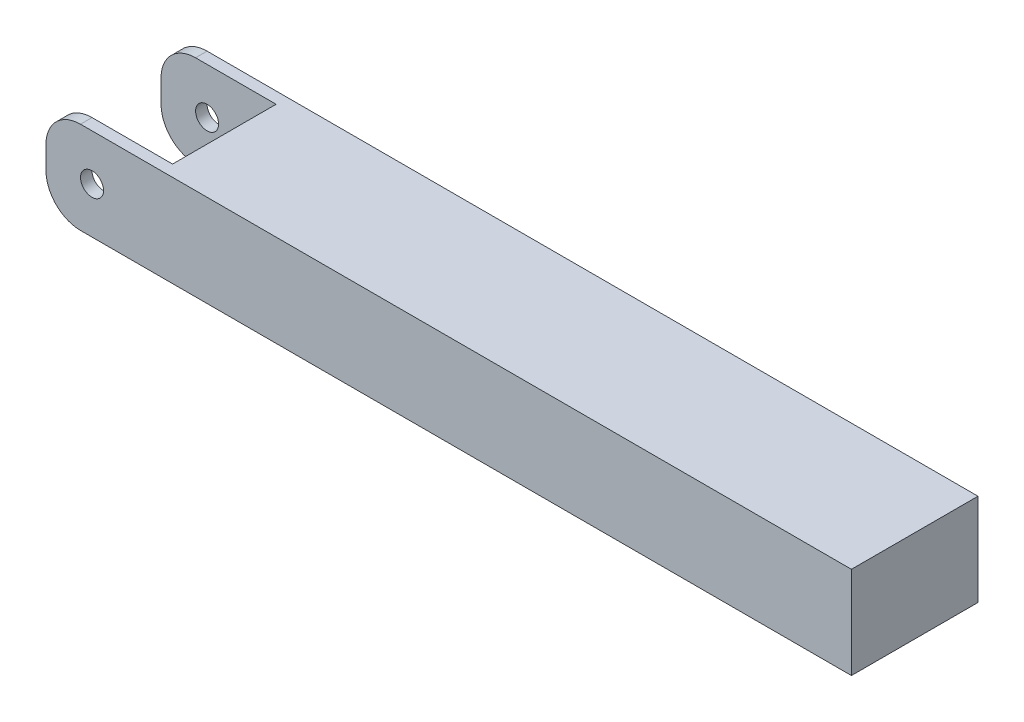
ISO-10303-21;
HEADER;
FILE_DESCRIPTION(('STEP AP214'),'2;1');
FILE_NAME('part.step','',(''),(''),'','','');
FILE_SCHEMA(('AUTOMOTIVE_DESIGN { 1 0 10303 214 1 1 1 1 }'));
ENDSEC;
DATA;
#1=APPLICATION_CONTEXT('core data for automotive mechanical design processes');
#2=APPLICATION_PROTOCOL_DEFINITION('international standard','automotive_design',2000,#1);
#3=PRODUCT_CONTEXT('',#1,'mechanical');
#4=PRODUCT('Part','Part','',(#3));
#5=PRODUCT_RELATED_PRODUCT_CATEGORY('part','',(#4));
#6=PRODUCT_DEFINITION_FORMATION('','',#4);
#7=PRODUCT_DEFINITION_CONTEXT('part definition',#1,'design');
#8=PRODUCT_DEFINITION('design','',#6,#7);
#9=PRODUCT_DEFINITION_SHAPE('','',#8);
#10=(LENGTH_UNIT() NAMED_UNIT(*) SI_UNIT(.MILLI.,.METRE.));
#11=(NAMED_UNIT(*) PLANE_ANGLE_UNIT() SI_UNIT($,.RADIAN.));
#12=(NAMED_UNIT(*) SI_UNIT($,.STERADIAN.) SOLID_ANGLE_UNIT());
#13=UNCERTAINTY_MEASURE_WITH_UNIT(LENGTH_MEASURE(1.E-05),#10,'distance_accuracy_value','');
#14=(GEOMETRIC_REPRESENTATION_CONTEXT(3) GLOBAL_UNCERTAINTY_ASSIGNED_CONTEXT((#13)) GLOBAL_UNIT_ASSIGNED_CONTEXT((#10,
#11,#12)) REPRESENTATION_CONTEXT('',''));
#15=CARTESIAN_POINT('',(0.,0.,0.));
#16=DIRECTION('',(0.,0.,1.));
#17=DIRECTION('',(1.,0.,0.));
#18=AXIS2_PLACEMENT_3D('',#15,#16,#17);
#19=CARTESIAN_POINT('',(150.,-20.,22.5));
#20=DIRECTION('',(-1.,0.,0.));
#21=DIRECTION('',(0.,0.,1.));
#22=AXIS2_PLACEMENT_3D('',#19,#20,#21);
#23=PLANE('',#22);
#24=DIRECTION('',(0.,0.,-1.));
#25=VECTOR('',#24,1.);
#26=CARTESIAN_POINT('',(150.,-20.,22.5));
#27=LINE('',#26,#25);
#28=CARTESIAN_POINT('',(150.,-20.,27.5));
#29=VERTEX_POINT('',#28);
#30=CARTESIAN_POINT('',(150.,-20.,-27.5));
#31=VERTEX_POINT('',#30);
#32=EDGE_CURVE('E128',#29,#31,#27,.T.);
#33=ORIENTED_EDGE('',*,*,#32,.T.);
#34=DIRECTION('',(0.,1.,0.));
#35=VECTOR('',#34,1.);
#36=CARTESIAN_POINT('',(150.,20.,-27.5));
#37=LINE('',#36,#35);
#38=CARTESIAN_POINT('',(150.,20.,-27.5));
#39=VERTEX_POINT('',#38);
#40=EDGE_CURVE('E133',#31,#39,#37,.T.);
#41=ORIENTED_EDGE('',*,*,#40,.T.);
#42=DIRECTION('',(0.,0.,-1.));
#43=VECTOR('',#42,1.);
#44=CARTESIAN_POINT('',(150.,20.,22.5));
#45=LINE('',#44,#43);
#46=CARTESIAN_POINT('',(150.,20.,27.5));
#47=VERTEX_POINT('',#46);
#48=EDGE_CURVE('E196',#47,#39,#45,.T.);
#49=ORIENTED_EDGE('',*,*,#48,.F.);
#50=DIRECTION('',(0.,1.,0.));
#51=VECTOR('',#50,1.);
#52=CARTESIAN_POINT('',(150.,20.,27.5));
#53=LINE('',#52,#51);
#54=EDGE_CURVE('E138',#29,#47,#53,.T.);
#55=ORIENTED_EDGE('',*,*,#54,.F.);
#56=EDGE_LOOP('',(#33,#41,#49,#55));
#57=FACE_BOUND('',#56,.T.);
#58=ADVANCED_FACE('F34',(#57),#23,.F.);
#59=CARTESIAN_POINT('',(-150.,20.,22.5));
#60=DIRECTION('',(0.,-1.,0.));
#61=DIRECTION('',(0.,0.,-1.));
#62=AXIS2_PLACEMENT_3D('',#59,#60,#61);
#63=PLANE('',#62);
#64=DIRECTION('',(-1.,0.,0.));
#65=VECTOR('',#64,1.);
#66=CARTESIAN_POINT('',(150.,20.,-27.5));
#67=LINE('',#66,#65);
#68=CARTESIAN_POINT('',(-185.,20.,-27.5));
#69=VERTEX_POINT('',#68);
#70=EDGE_CURVE('E143',#39,#69,#67,.T.);
#71=ORIENTED_EDGE('',*,*,#70,.T.);
#72=DIRECTION('',(0.,0.,1.));
#73=VECTOR('',#72,1.);
#74=CARTESIAN_POINT('',(-185.,20.,-22.5));
#75=LINE('',#74,#73);
#76=CARTESIAN_POINT('',(-185.,20.,-22.5));
#77=VERTEX_POINT('',#76);
#78=EDGE_CURVE('E11',#69,#77,#75,.T.);
#79=ORIENTED_EDGE('',*,*,#78,.T.);
#80=DIRECTION('',(-1.,0.,0.));
#81=VECTOR('',#80,1.);
#82=CARTESIAN_POINT('',(150.,20.,-22.5));
#83=LINE('',#82,#81);
#84=CARTESIAN_POINT('',(-150.,20.,-22.5));
#85=VERTEX_POINT('',#84);
#86=EDGE_CURVE('E144',#85,#77,#83,.T.);
#87=ORIENTED_EDGE('',*,*,#86,.F.);
#88=DIRECTION('',(0.,0.,-1.));
#89=VECTOR('',#88,1.);
#90=CARTESIAN_POINT('',(-150.,20.,22.5));
#91=LINE('',#90,#89);
#92=CARTESIAN_POINT('',(-150.,20.,22.5));
#93=VERTEX_POINT('',#92);
#94=EDGE_CURVE('E199',#93,#85,#91,.T.);
#95=ORIENTED_EDGE('',*,*,#94,.F.);
#96=DIRECTION('',(-1.,0.,0.));
#97=VECTOR('',#96,1.);
#98=CARTESIAN_POINT('',(150.,20.,22.5));
#99=LINE('',#98,#97);
#100=CARTESIAN_POINT('',(-185.,20.,22.5));
#101=VERTEX_POINT('',#100);
#102=EDGE_CURVE('E218',#93,#101,#99,.T.);
#103=ORIENTED_EDGE('',*,*,#102,.T.);
#104=DIRECTION('',(0.,0.,-1.));
#105=VECTOR('',#104,1.);
#106=CARTESIAN_POINT('',(-185.,20.,22.5));
#107=LINE('',#106,#105);
#108=CARTESIAN_POINT('',(-185.,20.,27.5));
#109=VERTEX_POINT('',#108);
#110=EDGE_CURVE('E182',#101,#109,#107,.F.);
#111=ORIENTED_EDGE('',*,*,#110,.T.);
#112=DIRECTION('',(-1.,0.,0.));
#113=VECTOR('',#112,1.);
#114=CARTESIAN_POINT('',(150.,20.,27.5));
#115=LINE('',#114,#113);
#116=EDGE_CURVE('E227',#47,#109,#115,.T.);
#117=ORIENTED_EDGE('',*,*,#116,.F.);
#118=ORIENTED_EDGE('',*,*,#48,.T.);
#119=EDGE_LOOP('',(#71,#79,#87,#95,#103,#111,#117,#118));
#120=FACE_BOUND('',#119,.T.);
#121=ADVANCED_FACE('F256',(#120),#63,.F.);
#122=CARTESIAN_POINT('',(-150.,-20.,22.5));
#123=DIRECTION('',(1.,0.,0.));
#124=DIRECTION('',(0.,0.,-1.));
#125=AXIS2_PLACEMENT_3D('',#122,#123,#124);
#126=PLANE('',#125);
#127=DIRECTION('',(0.,-1.,0.));
#128=VECTOR('',#127,1.);
#129=CARTESIAN_POINT('',(-150.,-20.,-22.5));
#130=LINE('',#129,#128);
#131=CARTESIAN_POINT('',(-150.,-20.,-22.5));
#132=VERTEX_POINT('',#131);
#133=EDGE_CURVE('E186',#85,#132,#130,.T.);
#134=ORIENTED_EDGE('',*,*,#133,.T.);
#135=DIRECTION('',(0.,0.,-1.));
#136=VECTOR('',#135,1.);
#137=CARTESIAN_POINT('',(-150.,-20.,22.5));
#138=LINE('',#137,#136);
#139=CARTESIAN_POINT('',(-150.,-20.,22.5));
#140=VERTEX_POINT('',#139);
#141=EDGE_CURVE('E139',#140,#132,#138,.T.);
#142=ORIENTED_EDGE('',*,*,#141,.F.);
#143=DIRECTION('',(0.,-1.,0.));
#144=VECTOR('',#143,1.);
#145=CARTESIAN_POINT('',(-150.,-20.,22.5));
#146=LINE('',#145,#144);
#147=EDGE_CURVE('E140',#93,#140,#146,.T.);
#148=ORIENTED_EDGE('',*,*,#147,.F.);
#149=ORIENTED_EDGE('',*,*,#94,.T.);
#150=EDGE_LOOP('',(#134,#142,#148,#149));
#151=FACE_BOUND('',#150,.T.);
#152=ADVANCED_FACE('F252',(#151),#126,.F.);
#153=CARTESIAN_POINT('',(-150.,-20.,22.5));
#154=DIRECTION('',(0.,1.,0.));
#155=DIRECTION('',(0.,0.,1.));
#156=AXIS2_PLACEMENT_3D('',#153,#154,#155);
#157=PLANE('',#156);
#158=DIRECTION('',(1.,0.,0.));
#159=VECTOR('',#158,1.);
#160=CARTESIAN_POINT('',(150.,-20.,-22.5));
#161=LINE('',#160,#159);
#162=CARTESIAN_POINT('',(-185.,-20.,-22.5));
#163=VERTEX_POINT('',#162);
#164=EDGE_CURVE('E161',#163,#132,#161,.T.);
#165=ORIENTED_EDGE('',*,*,#164,.F.);
#166=DIRECTION('',(0.,0.,1.));
#167=VECTOR('',#166,1.);
#168=CARTESIAN_POINT('',(-185.,-20.,-27.5));
#169=LINE('',#168,#167);
#170=CARTESIAN_POINT('',(-185.,-20.,-27.5));
#171=VERTEX_POINT('',#170);
#172=EDGE_CURVE('E57',#163,#171,#169,.F.);
#173=ORIENTED_EDGE('',*,*,#172,.T.);
#174=DIRECTION('',(1.,0.,0.));
#175=VECTOR('',#174,1.);
#176=CARTESIAN_POINT('',(150.,-20.,-27.5));
#177=LINE('',#176,#175);
#178=EDGE_CURVE('E124',#171,#31,#177,.T.);
#179=ORIENTED_EDGE('',*,*,#178,.T.);
#180=ORIENTED_EDGE('',*,*,#32,.F.);
#181=DIRECTION('',(1.,0.,0.));
#182=VECTOR('',#181,1.);
#183=CARTESIAN_POINT('',(150.,-20.,27.5));
#184=LINE('',#183,#182);
#185=CARTESIAN_POINT('',(-185.,-20.,27.5));
#186=VERTEX_POINT('',#185);
#187=EDGE_CURVE('E189',#186,#29,#184,.T.);
#188=ORIENTED_EDGE('',*,*,#187,.F.);
#189=DIRECTION('',(0.,0.,-1.));
#190=VECTOR('',#189,1.);
#191=CARTESIAN_POINT('',(-185.,-20.,22.5));
#192=LINE('',#191,#190);
#193=CARTESIAN_POINT('',(-185.,-20.,22.5));
#194=VERTEX_POINT('',#193);
#195=EDGE_CURVE('E198',#186,#194,#192,.T.);
#196=ORIENTED_EDGE('',*,*,#195,.T.);
#197=DIRECTION('',(1.,0.,0.));
#198=VECTOR('',#197,1.);
#199=CARTESIAN_POINT('',(150.,-20.,22.5));
#200=LINE('',#199,#198);
#201=EDGE_CURVE('E210',#194,#140,#200,.T.);
#202=ORIENTED_EDGE('',*,*,#201,.T.);
#203=ORIENTED_EDGE('',*,*,#141,.T.);
#204=EDGE_LOOP('',(#165,#173,#179,#180,#188,#196,#202,#203));
#205=FACE_BOUND('',#204,.T.);
#206=ADVANCED_FACE('F126',(#205),#157,.F.);
#207=CARTESIAN_POINT('',(0.,0.,27.5));
#208=DIRECTION('',(0.,0.,-1.));
#209=DIRECTION('',(-1.,0.,0.));
#210=AXIS2_PLACEMENT_3D('',#207,#208,#209);
#211=PLANE('',#210);
#212=DIRECTION('',(0.,-1.,0.));
#213=VECTOR('',#212,1.);
#214=CARTESIAN_POINT('',(-200.,20.,27.5));
#215=LINE('',#214,#213);
#216=CARTESIAN_POINT('',(-200.,5.,27.5));
#217=VERTEX_POINT('',#216);
#218=CARTESIAN_POINT('',(-200.,-5.,27.5));
#219=VERTEX_POINT('',#218);
#220=EDGE_CURVE('E224',#217,#219,#215,.T.);
#221=ORIENTED_EDGE('',*,*,#220,.T.);
#222=CARTESIAN_POINT('',(-185.,-5.,27.5));
#223=DIRECTION('',(0.,0.,-1.));
#224=DIRECTION('',(-1.,0.,0.));
#225=AXIS2_PLACEMENT_3D('',#222,#223,#224);
#226=CIRCLE('',#225,15.);
#227=EDGE_CURVE('E183',#219,#186,#226,.F.);
#228=ORIENTED_EDGE('',*,*,#227,.T.);
#229=ORIENTED_EDGE('',*,*,#187,.T.);
#230=ORIENTED_EDGE('',*,*,#54,.T.);
#231=ORIENTED_EDGE('',*,*,#116,.T.);
#232=CARTESIAN_POINT('',(-185.,5.,27.5));
#233=DIRECTION('',(0.,0.,-1.));
#234=DIRECTION('',(-1.,0.,0.));
#235=AXIS2_PLACEMENT_3D('',#232,#233,#234);
#236=CIRCLE('',#235,15.);
#237=EDGE_CURVE('E324',#109,#217,#236,.F.);
#238=ORIENTED_EDGE('',*,*,#237,.T.);
#239=EDGE_LOOP('',(#221,#228,#229,#230,#231,#238));
#240=FACE_BOUND('',#239,.T.);
#241=CARTESIAN_POINT('',(-180.,0.,27.5));
#242=DIRECTION('',(0.,0.,1.));
#243=DIRECTION('',(1.,0.,0.));
#244=AXIS2_PLACEMENT_3D('',#241,#242,#243);
#245=CIRCLE('',#244,5.00000000000002);
#246=CARTESIAN_POINT('',(-175.,0.,27.5));
#247=VERTEX_POINT('',#246);
#248=EDGE_CURVE('E220',#247,#247,#245,.T.);
#249=ORIENTED_EDGE('',*,*,#248,.F.);
#250=EDGE_LOOP('',(#249));
#251=FACE_BOUND('',#250,.T.);
#252=ADVANCED_FACE('F240',(#240,#251),#211,.F.);
#253=CARTESIAN_POINT('',(0.,0.,22.5));
#254=DIRECTION('',(0.,0.,-1.));
#255=DIRECTION('',(-1.,0.,0.));
#256=AXIS2_PLACEMENT_3D('',#253,#254,#255);
#257=PLANE('',#256);
#258=ORIENTED_EDGE('',*,*,#201,.F.);
#259=CARTESIAN_POINT('',(-185.,-5.,22.5));
#260=DIRECTION('',(0.,0.,-1.));
#261=DIRECTION('',(-1.,0.,0.));
#262=AXIS2_PLACEMENT_3D('',#259,#260,#261);
#263=CIRCLE('',#262,15.);
#264=CARTESIAN_POINT('',(-200.,-5.,22.5));
#265=VERTEX_POINT('',#264);
#266=EDGE_CURVE('E316',#194,#265,#263,.T.);
#267=ORIENTED_EDGE('',*,*,#266,.T.);
#268=DIRECTION('',(0.,-1.,0.));
#269=VECTOR('',#268,1.);
#270=CARTESIAN_POINT('',(-200.,20.,22.5));
#271=LINE('',#270,#269);
#272=CARTESIAN_POINT('',(-200.,5.,22.5));
#273=VERTEX_POINT('',#272);
#274=EDGE_CURVE('E213',#273,#265,#271,.T.);
#275=ORIENTED_EDGE('',*,*,#274,.F.);
#276=CARTESIAN_POINT('',(-185.,5.,22.5));
#277=DIRECTION('',(0.,0.,-1.));
#278=DIRECTION('',(-1.,0.,0.));
#279=AXIS2_PLACEMENT_3D('',#276,#277,#278);
#280=CIRCLE('',#279,15.);
#281=EDGE_CURVE('E318',#273,#101,#280,.T.);
#282=ORIENTED_EDGE('',*,*,#281,.T.);
#283=ORIENTED_EDGE('',*,*,#102,.F.);
#284=ORIENTED_EDGE('',*,*,#147,.T.);
#285=EDGE_LOOP('',(#258,#267,#275,#282,#283,#284));
#286=FACE_BOUND('',#285,.T.);
#287=CARTESIAN_POINT('',(-180.,0.,22.5));
#288=DIRECTION('',(0.,0.,1.));
#289=DIRECTION('',(1.,0.,0.));
#290=AXIS2_PLACEMENT_3D('',#287,#288,#289);
#291=CIRCLE('',#290,5.00000000000002);
#292=CARTESIAN_POINT('',(-175.,0.,22.5));
#293=VERTEX_POINT('',#292);
#294=EDGE_CURVE('E156',#293,#293,#291,.T.);
#295=ORIENTED_EDGE('',*,*,#294,.T.);
#296=EDGE_LOOP('',(#295));
#297=FACE_BOUND('',#296,.T.);
#298=ADVANCED_FACE('F242',(#286,#297),#257,.T.);
#299=CARTESIAN_POINT('',(-200.,20.,27.5));
#300=DIRECTION('',(1.,0.,0.));
#301=DIRECTION('',(0.,0.,-1.));
#302=AXIS2_PLACEMENT_3D('',#299,#300,#301);
#303=PLANE('',#302);
#304=ORIENTED_EDGE('',*,*,#274,.T.);
#305=DIRECTION('',(0.,0.,-1.));
#306=VECTOR('',#305,1.);
#307=CARTESIAN_POINT('',(-200.,-5.,27.5));
#308=LINE('',#307,#306);
#309=EDGE_CURVE('E327',#265,#219,#308,.F.);
#310=ORIENTED_EDGE('',*,*,#309,.T.);
#311=ORIENTED_EDGE('',*,*,#220,.F.);
#312=DIRECTION('',(0.,0.,-1.));
#313=VECTOR('',#312,1.);
#314=CARTESIAN_POINT('',(-200.,5.,27.5));
#315=LINE('',#314,#313);
#316=EDGE_CURVE('E325',#217,#273,#315,.T.);
#317=ORIENTED_EDGE('',*,*,#316,.T.);
#318=EDGE_LOOP('',(#304,#310,#311,#317));
#319=FACE_BOUND('',#318,.T.);
#320=ADVANCED_FACE('F249',(#319),#303,.F.);
#321=CARTESIAN_POINT('',(-180.,0.,27.5));
#322=DIRECTION('',(0.,0.,-1.));
#323=DIRECTION('',(-1.,0.,0.));
#324=AXIS2_PLACEMENT_3D('',#321,#322,#323);
#325=CYLINDRICAL_SURFACE('',#324,5.00000000000002);
#326=ORIENTED_EDGE('',*,*,#248,.T.);
#327=EDGE_LOOP('',(#326));
#328=FACE_BOUND('',#327,.T.);
#329=ORIENTED_EDGE('',*,*,#294,.F.);
#330=EDGE_LOOP('',(#329));
#331=FACE_BOUND('',#330,.T.);
#332=ADVANCED_FACE('F237',(#328,#331),#325,.F.);
#333=CARTESIAN_POINT('',(-185.,-5.,22.5));
#334=DIRECTION('',(0.,0.,-1.));
#335=DIRECTION('',(-1.,0.,0.));
#336=AXIS2_PLACEMENT_3D('',#333,#334,#335);
#337=CYLINDRICAL_SURFACE('',#336,15.);
#338=ORIENTED_EDGE('',*,*,#227,.F.);
#339=ORIENTED_EDGE('',*,*,#309,.F.);
#340=ORIENTED_EDGE('',*,*,#266,.F.);
#341=ORIENTED_EDGE('',*,*,#195,.F.);
#342=EDGE_LOOP('',(#338,#339,#340,#341));
#343=FACE_BOUND('',#342,.T.);
#344=ADVANCED_FACE('F265',(#343),#337,.T.);
#345=CARTESIAN_POINT('',(-185.,5.,27.5));
#346=DIRECTION('',(0.,0.,-1.));
#347=DIRECTION('',(-1.,0.,0.));
#348=AXIS2_PLACEMENT_3D('',#345,#346,#347);
#349=CYLINDRICAL_SURFACE('',#348,15.);
#350=ORIENTED_EDGE('',*,*,#237,.F.);
#351=ORIENTED_EDGE('',*,*,#110,.F.);
#352=ORIENTED_EDGE('',*,*,#281,.F.);
#353=ORIENTED_EDGE('',*,*,#316,.F.);
#354=EDGE_LOOP('',(#350,#351,#352,#353));
#355=FACE_BOUND('',#354,.T.);
#356=ADVANCED_FACE('F268',(#355),#349,.T.);
#357=CARTESIAN_POINT('',(0.,0.,-22.5));
#358=DIRECTION('',(0.,0.,1.));
#359=DIRECTION('',(-1.,0.,0.));
#360=AXIS2_PLACEMENT_3D('',#357,#358,#359);
#361=PLANE('',#360);
#362=CARTESIAN_POINT('',(-180.,0.,-22.5));
#363=DIRECTION('',(0.,0.,1.));
#364=DIRECTION('',(1.,0.,0.));
#365=AXIS2_PLACEMENT_3D('',#362,#363,#364);
#366=CIRCLE('',#365,5.00000000000002);
#367=CARTESIAN_POINT('',(-175.,0.,-22.5));
#368=VERTEX_POINT('',#367);
#369=EDGE_CURVE('E150',#368,#368,#366,.T.);
#370=ORIENTED_EDGE('',*,*,#369,.F.);
#371=EDGE_LOOP('',(#370));
#372=FACE_BOUND('',#371,.T.);
#373=DIRECTION('',(0.,-1.,0.));
#374=VECTOR('',#373,1.);
#375=CARTESIAN_POINT('',(-200.,20.,-22.5));
#376=LINE('',#375,#374);
#377=CARTESIAN_POINT('',(-200.,5.,-22.5));
#378=VERTEX_POINT('',#377);
#379=CARTESIAN_POINT('',(-200.,-5.,-22.5));
#380=VERTEX_POINT('',#379);
#381=EDGE_CURVE('E147',#378,#380,#376,.T.);
#382=ORIENTED_EDGE('',*,*,#381,.T.);
#383=CARTESIAN_POINT('',(-185.,-5.,-22.5));
#384=DIRECTION('',(0.,0.,1.));
#385=DIRECTION('',(1.,0.,0.));
#386=AXIS2_PLACEMENT_3D('',#383,#384,#385);
#387=CIRCLE('',#386,15.);
#388=EDGE_CURVE('E169',#380,#163,#387,.T.);
#389=ORIENTED_EDGE('',*,*,#388,.T.);
#390=ORIENTED_EDGE('',*,*,#164,.T.);
#391=ORIENTED_EDGE('',*,*,#133,.F.);
#392=ORIENTED_EDGE('',*,*,#86,.T.);
#393=CARTESIAN_POINT('',(-185.,5.,-22.5));
#394=DIRECTION('',(0.,0.,1.));
#395=DIRECTION('',(1.,0.,0.));
#396=AXIS2_PLACEMENT_3D('',#393,#394,#395);
#397=CIRCLE('',#396,15.);
#398=EDGE_CURVE('E167',#77,#378,#397,.T.);
#399=ORIENTED_EDGE('',*,*,#398,.T.);
#400=EDGE_LOOP('',(#382,#389,#390,#391,#392,#399));
#401=FACE_BOUND('',#400,.T.);
#402=ADVANCED_FACE('F271',(#372,#401),#361,.T.);
#403=CARTESIAN_POINT('',(-200.,20.,-27.5));
#404=DIRECTION('',(-1.,0.,0.));
#405=DIRECTION('',(0.,0.,1.));
#406=AXIS2_PLACEMENT_3D('',#403,#404,#405);
#407=PLANE('',#406);
#408=DIRECTION('',(0.,-1.,0.));
#409=VECTOR('',#408,1.);
#410=CARTESIAN_POINT('',(-200.,20.,-27.5));
#411=LINE('',#410,#409);
#412=CARTESIAN_POINT('',(-200.,5.,-27.5));
#413=VERTEX_POINT('',#412);
#414=CARTESIAN_POINT('',(-200.,-5.,-27.5));
#415=VERTEX_POINT('',#414);
#416=EDGE_CURVE('E132',#413,#415,#411,.T.);
#417=ORIENTED_EDGE('',*,*,#416,.T.);
#418=DIRECTION('',(0.,0.,1.));
#419=VECTOR('',#418,1.);
#420=CARTESIAN_POINT('',(-200.,-5.,-22.5));
#421=LINE('',#420,#419);
#422=EDGE_CURVE('E165',#415,#380,#421,.T.);
#423=ORIENTED_EDGE('',*,*,#422,.T.);
#424=ORIENTED_EDGE('',*,*,#381,.F.);
#425=DIRECTION('',(0.,0.,1.));
#426=VECTOR('',#425,1.);
#427=CARTESIAN_POINT('',(-200.,5.,-27.5));
#428=LINE('',#427,#426);
#429=EDGE_CURVE('E180',#378,#413,#428,.F.);
#430=ORIENTED_EDGE('',*,*,#429,.T.);
#431=EDGE_LOOP('',(#417,#423,#424,#430));
#432=FACE_BOUND('',#431,.T.);
#433=ADVANCED_FACE('F176',(#432),#407,.T.);
#434=CARTESIAN_POINT('',(0.,0.,-27.5));
#435=DIRECTION('',(0.,0.,1.));
#436=DIRECTION('',(-1.,0.,0.));
#437=AXIS2_PLACEMENT_3D('',#434,#435,#436);
#438=PLANE('',#437);
#439=CARTESIAN_POINT('',(-180.,0.,-27.5));
#440=DIRECTION('',(0.,0.,1.));
#441=DIRECTION('',(1.,0.,0.));
#442=AXIS2_PLACEMENT_3D('',#439,#440,#441);
#443=CIRCLE('',#442,5.00000000000002);
#444=CARTESIAN_POINT('',(-175.,0.,-27.5));
#445=VERTEX_POINT('',#444);
#446=EDGE_CURVE('E164',#445,#445,#443,.T.);
#447=ORIENTED_EDGE('',*,*,#446,.T.);
#448=EDGE_LOOP('',(#447));
#449=FACE_BOUND('',#448,.T.);
#450=ORIENTED_EDGE('',*,*,#178,.F.);
#451=CARTESIAN_POINT('',(-185.,-5.,-27.5));
#452=DIRECTION('',(0.,0.,1.));
#453=DIRECTION('',(1.,0.,0.));
#454=AXIS2_PLACEMENT_3D('',#451,#452,#453);
#455=CIRCLE('',#454,15.);
#456=EDGE_CURVE('E42',#171,#415,#455,.F.);
#457=ORIENTED_EDGE('',*,*,#456,.T.);
#458=ORIENTED_EDGE('',*,*,#416,.F.);
#459=CARTESIAN_POINT('',(-185.,5.,-27.5));
#460=DIRECTION('',(0.,0.,1.));
#461=DIRECTION('',(1.,0.,0.));
#462=AXIS2_PLACEMENT_3D('',#459,#460,#461);
#463=CIRCLE('',#462,15.);
#464=EDGE_CURVE('E49',#413,#69,#463,.F.);
#465=ORIENTED_EDGE('',*,*,#464,.T.);
#466=ORIENTED_EDGE('',*,*,#70,.F.);
#467=ORIENTED_EDGE('',*,*,#40,.F.);
#468=EDGE_LOOP('',(#450,#457,#458,#465,#466,#467));
#469=FACE_BOUND('',#468,.T.);
#470=ADVANCED_FACE('F142',(#449,#469),#438,.F.);
#471=CARTESIAN_POINT('',(-180.,0.,-27.5));
#472=DIRECTION('',(0.,0.,1.));
#473=DIRECTION('',(1.,0.,0.));
#474=AXIS2_PLACEMENT_3D('',#471,#472,#473);
#475=CYLINDRICAL_SURFACE('',#474,5.00000000000002);
#476=ORIENTED_EDGE('',*,*,#446,.F.);
#477=EDGE_LOOP('',(#476));
#478=FACE_BOUND('',#477,.T.);
#479=ORIENTED_EDGE('',*,*,#369,.T.);
#480=EDGE_LOOP('',(#479));
#481=FACE_BOUND('',#480,.T.);
#482=ADVANCED_FACE('F274',(#478,#481),#475,.F.);
#483=CARTESIAN_POINT('',(-185.,-5.,-27.5));
#484=DIRECTION('',(0.,0.,-1.));
#485=DIRECTION('',(-1.,0.,0.));
#486=AXIS2_PLACEMENT_3D('',#483,#484,#485);
#487=CYLINDRICAL_SURFACE('',#486,15.);
#488=ORIENTED_EDGE('',*,*,#456,.F.);
#489=ORIENTED_EDGE('',*,*,#172,.F.);
#490=ORIENTED_EDGE('',*,*,#388,.F.);
#491=ORIENTED_EDGE('',*,*,#422,.F.);
#492=EDGE_LOOP('',(#488,#489,#490,#491));
#493=FACE_BOUND('',#492,.T.);
#494=ADVANCED_FACE('F181',(#493),#487,.T.);
#495=CARTESIAN_POINT('',(-185.,5.,22.5));
#496=DIRECTION('',(0.,0.,-1.));
#497=DIRECTION('',(-1.,0.,0.));
#498=AXIS2_PLACEMENT_3D('',#495,#496,#497);
#499=CYLINDRICAL_SURFACE('',#498,15.);
#500=ORIENTED_EDGE('',*,*,#464,.F.);
#501=ORIENTED_EDGE('',*,*,#429,.F.);
#502=ORIENTED_EDGE('',*,*,#398,.F.);
#503=ORIENTED_EDGE('',*,*,#78,.F.);
#504=EDGE_LOOP('',(#500,#501,#502,#503));
#505=FACE_BOUND('',#504,.T.);
#506=ADVANCED_FACE('F36',(#505),#499,.T.);
#507=CLOSED_SHELL('',(#58,#121,#152,#206,#252,#298,#320,#332,#344,#356,#402,#433,#470,#482,#494,#506));
#508=MANIFOLD_SOLID_BREP('B2',#507);
#509=ADVANCED_BREP_SHAPE_REPRESENTATION('',(#18,#508),#14);
#510=SHAPE_DEFINITION_REPRESENTATION(#9,#509);
ENDSEC;
END-ISO-10303-21;
